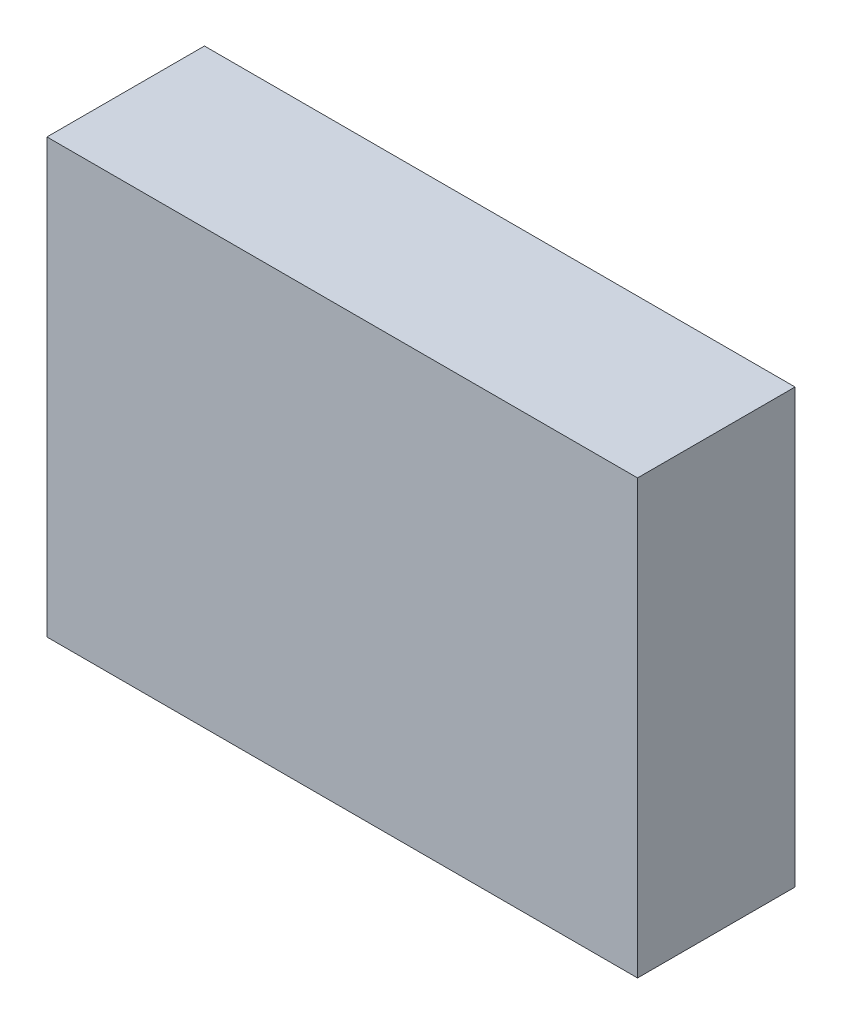
ISO-10303-21;
HEADER;
FILE_DESCRIPTION(('STEP AP214'),'2;1');
FILE_NAME('part.step','',(''),(''),'','','');
FILE_SCHEMA(('AUTOMOTIVE_DESIGN { 1 0 10303 214 1 1 1 1 }'));
ENDSEC;
DATA;
#1=APPLICATION_CONTEXT('core data for automotive mechanical design processes');
#2=APPLICATION_PROTOCOL_DEFINITION('international standard','automotive_design',2000,#1);
#3=PRODUCT_CONTEXT('',#1,'mechanical');
#4=PRODUCT('Part','Part','',(#3));
#5=PRODUCT_RELATED_PRODUCT_CATEGORY('part','',(#4));
#6=PRODUCT_DEFINITION_FORMATION('','',#4);
#7=PRODUCT_DEFINITION_CONTEXT('part definition',#1,'design');
#8=PRODUCT_DEFINITION('design','',#6,#7);
#9=PRODUCT_DEFINITION_SHAPE('','',#8);
#10=(LENGTH_UNIT() NAMED_UNIT(*) SI_UNIT(.MILLI.,.METRE.));
#11=(NAMED_UNIT(*) PLANE_ANGLE_UNIT() SI_UNIT($,.RADIAN.));
#12=(NAMED_UNIT(*) SI_UNIT($,.STERADIAN.) SOLID_ANGLE_UNIT());
#13=UNCERTAINTY_MEASURE_WITH_UNIT(LENGTH_MEASURE(1.E-05),#10,'distance_accuracy_value','');
#14=(GEOMETRIC_REPRESENTATION_CONTEXT(3) GLOBAL_UNCERTAINTY_ASSIGNED_CONTEXT((#13)) GLOBAL_UNIT_ASSIGNED_CONTEXT((#10,
#11,#12)) REPRESENTATION_CONTEXT('',''));
#15=CARTESIAN_POINT('',(0.,0.,0.));
#16=DIRECTION('',(0.,0.,1.));
#17=DIRECTION('',(1.,0.,0.));
#18=AXIS2_PLACEMENT_3D('',#15,#16,#17);
#19=CARTESIAN_POINT('',(45.,66.,12.));
#20=DIRECTION('',(-1.,0.,0.));
#21=DIRECTION('',(0.,0.,1.));
#22=AXIS2_PLACEMENT_3D('',#19,#20,#21);
#23=PLANE('',#22);
#24=DIRECTION('',(0.,0.,-1.));
#25=VECTOR('',#24,1.);
#26=CARTESIAN_POINT('',(45.,0.,12.));
#27=LINE('',#26,#25);
#28=CARTESIAN_POINT('',(45.,0.,12.));
#29=VERTEX_POINT('',#28);
#30=CARTESIAN_POINT('',(45.,0.,-12.));
#31=VERTEX_POINT('',#30);
#32=EDGE_CURVE('E96',#29,#31,#27,.T.);
#33=ORIENTED_EDGE('',*,*,#32,.T.);
#34=DIRECTION('',(0.,-1.,0.));
#35=VECTOR('',#34,1.);
#36=CARTESIAN_POINT('',(45.,66.,-12.));
#37=LINE('',#36,#35);
#38=CARTESIAN_POINT('',(45.,66.,-12.));
#39=VERTEX_POINT('',#38);
#40=EDGE_CURVE('E11',#39,#31,#37,.T.);
#41=ORIENTED_EDGE('',*,*,#40,.F.);
#42=DIRECTION('',(0.,0.,-1.));
#43=VECTOR('',#42,1.);
#44=CARTESIAN_POINT('',(45.,66.,12.));
#45=LINE('',#44,#43);
#46=CARTESIAN_POINT('',(45.,66.,12.));
#47=VERTEX_POINT('',#46);
#48=EDGE_CURVE('E84',#47,#39,#45,.T.);
#49=ORIENTED_EDGE('',*,*,#48,.F.);
#50=DIRECTION('',(0.,-1.,0.));
#51=VECTOR('',#50,1.);
#52=CARTESIAN_POINT('',(45.,66.,12.));
#53=LINE('',#52,#51);
#54=EDGE_CURVE('E92',#47,#29,#53,.T.);
#55=ORIENTED_EDGE('',*,*,#54,.T.);
#56=EDGE_LOOP('',(#33,#41,#49,#55));
#57=FACE_BOUND('',#56,.T.);
#58=ADVANCED_FACE('F33',(#57),#23,.F.);
#59=CARTESIAN_POINT('',(-45.,66.,-12.));
#60=DIRECTION('',(0.,0.,1.));
#61=DIRECTION('',(1.,0.,0.));
#62=AXIS2_PLACEMENT_3D('',#59,#60,#61);
#63=PLANE('',#62);
#64=DIRECTION('',(-1.,0.,0.));
#65=VECTOR('',#64,1.);
#66=CARTESIAN_POINT('',(-45.,0.,-12.));
#67=LINE('',#66,#65);
#68=CARTESIAN_POINT('',(-45.,0.,-12.));
#69=VERTEX_POINT('',#68);
#70=EDGE_CURVE('E88',#31,#69,#67,.T.);
#71=ORIENTED_EDGE('',*,*,#70,.T.);
#72=DIRECTION('',(0.,-1.,0.));
#73=VECTOR('',#72,1.);
#74=CARTESIAN_POINT('',(-45.,66.,-12.));
#75=LINE('',#74,#73);
#76=CARTESIAN_POINT('',(-45.,66.,-12.));
#77=VERTEX_POINT('',#76);
#78=EDGE_CURVE('E41',#77,#69,#75,.T.);
#79=ORIENTED_EDGE('',*,*,#78,.F.);
#80=DIRECTION('',(-1.,0.,0.));
#81=VECTOR('',#80,1.);
#82=CARTESIAN_POINT('',(-45.,66.,-12.));
#83=LINE('',#82,#81);
#84=EDGE_CURVE('E79',#39,#77,#83,.T.);
#85=ORIENTED_EDGE('',*,*,#84,.F.);
#86=ORIENTED_EDGE('',*,*,#40,.T.);
#87=EDGE_LOOP('',(#71,#79,#85,#86));
#88=FACE_BOUND('',#87,.T.);
#89=ADVANCED_FACE('F87',(#88),#63,.F.);
#90=CARTESIAN_POINT('',(-45.,66.,12.));
#91=DIRECTION('',(1.,0.,0.));
#92=DIRECTION('',(0.,0.,-1.));
#93=AXIS2_PLACEMENT_3D('',#90,#91,#92);
#94=PLANE('',#93);
#95=DIRECTION('',(0.,0.,1.));
#96=VECTOR('',#95,1.);
#97=CARTESIAN_POINT('',(-45.,0.,12.));
#98=LINE('',#97,#96);
#99=CARTESIAN_POINT('',(-45.,0.,12.));
#100=VERTEX_POINT('',#99);
#101=EDGE_CURVE('E66',#69,#100,#98,.T.);
#102=ORIENTED_EDGE('',*,*,#101,.T.);
#103=DIRECTION('',(0.,-1.,0.));
#104=VECTOR('',#103,1.);
#105=CARTESIAN_POINT('',(-45.,66.,12.));
#106=LINE('',#105,#104);
#107=CARTESIAN_POINT('',(-45.,66.,12.));
#108=VERTEX_POINT('',#107);
#109=EDGE_CURVE('E89',#108,#100,#106,.T.);
#110=ORIENTED_EDGE('',*,*,#109,.F.);
#111=DIRECTION('',(0.,0.,1.));
#112=VECTOR('',#111,1.);
#113=CARTESIAN_POINT('',(-45.,66.,12.));
#114=LINE('',#113,#112);
#115=EDGE_CURVE('E82',#77,#108,#114,.T.);
#116=ORIENTED_EDGE('',*,*,#115,.F.);
#117=ORIENTED_EDGE('',*,*,#78,.T.);
#118=EDGE_LOOP('',(#102,#110,#116,#117));
#119=FACE_BOUND('',#118,.T.);
#120=ADVANCED_FACE('F90',(#119),#94,.F.);
#121=CARTESIAN_POINT('',(-45.,66.,12.));
#122=DIRECTION('',(0.,0.,-1.));
#123=DIRECTION('',(-1.,0.,0.));
#124=AXIS2_PLACEMENT_3D('',#121,#122,#123);
#125=PLANE('',#124);
#126=DIRECTION('',(1.,0.,0.));
#127=VECTOR('',#126,1.);
#128=CARTESIAN_POINT('',(-45.,0.,12.));
#129=LINE('',#128,#127);
#130=EDGE_CURVE('E72',#100,#29,#129,.T.);
#131=ORIENTED_EDGE('',*,*,#130,.T.);
#132=ORIENTED_EDGE('',*,*,#54,.F.);
#133=DIRECTION('',(1.,0.,0.));
#134=VECTOR('',#133,1.);
#135=CARTESIAN_POINT('',(-45.,66.,12.));
#136=LINE('',#135,#134);
#137=EDGE_CURVE('E49',#108,#47,#136,.T.);
#138=ORIENTED_EDGE('',*,*,#137,.F.);
#139=ORIENTED_EDGE('',*,*,#109,.T.);
#140=EDGE_LOOP('',(#131,#132,#138,#139));
#141=FACE_BOUND('',#140,.T.);
#142=ADVANCED_FACE('F103',(#141),#125,.F.);
#143=CARTESIAN_POINT('',(0.,66.,0.));
#144=DIRECTION('',(0.,-1.,0.));
#145=DIRECTION('',(0.,0.,-1.));
#146=AXIS2_PLACEMENT_3D('',#143,#144,#145);
#147=PLANE('',#146);
#148=ORIENTED_EDGE('',*,*,#48,.T.);
#149=ORIENTED_EDGE('',*,*,#84,.T.);
#150=ORIENTED_EDGE('',*,*,#115,.T.);
#151=ORIENTED_EDGE('',*,*,#137,.T.);
#152=EDGE_LOOP('',(#148,#149,#150,#151));
#153=FACE_BOUND('',#152,.T.);
#154=ADVANCED_FACE('F80',(#153),#147,.F.);
#155=CARTESIAN_POINT('',(0.,0.,0.));
#156=DIRECTION('',(0.,-1.,0.));
#157=DIRECTION('',(0.,0.,-1.));
#158=AXIS2_PLACEMENT_3D('',#155,#156,#157);
#159=PLANE('',#158);
#160=ORIENTED_EDGE('',*,*,#32,.F.);
#161=ORIENTED_EDGE('',*,*,#130,.F.);
#162=ORIENTED_EDGE('',*,*,#101,.F.);
#163=ORIENTED_EDGE('',*,*,#70,.F.);
#164=EDGE_LOOP('',(#160,#161,#162,#163));
#165=FACE_BOUND('',#164,.T.);
#166=ADVANCED_FACE('F106',(#165),#159,.T.);
#167=CLOSED_SHELL('',(#58,#89,#120,#142,#154,#166));
#168=MANIFOLD_SOLID_BREP('B2',#167);
#169=ADVANCED_BREP_SHAPE_REPRESENTATION('',(#18,#168),#14);
#170=SHAPE_DEFINITION_REPRESENTATION(#9,#169);
ENDSEC;
END-ISO-10303-21;
